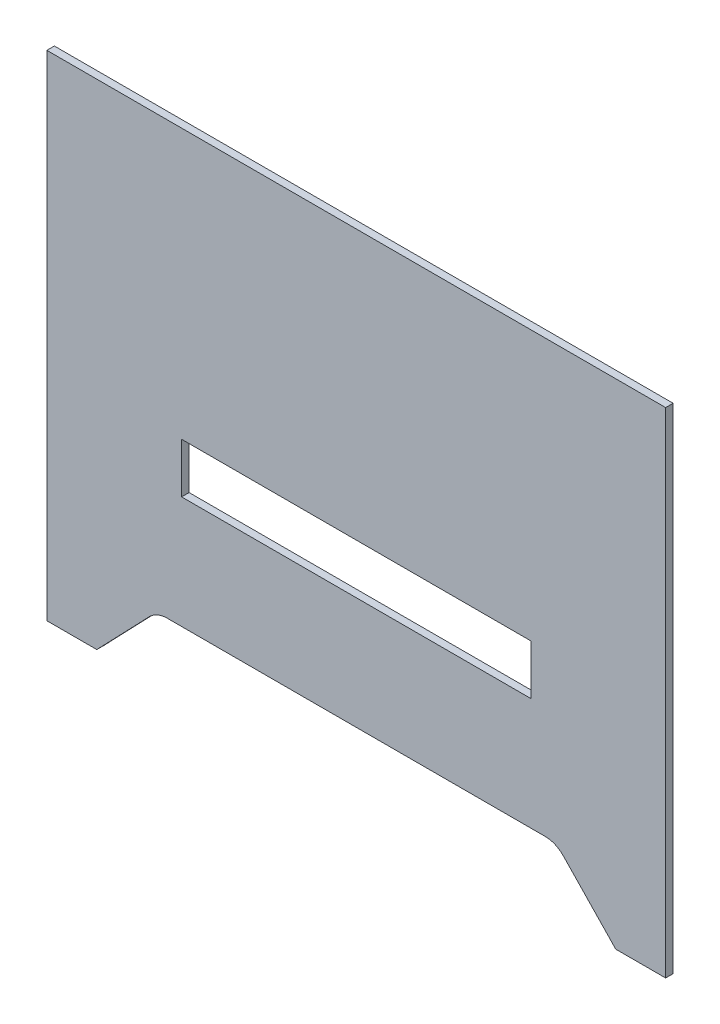
ISO-10303-21;
HEADER;
FILE_DESCRIPTION(('STEP AP214'),'2;1');
FILE_NAME('part.step','',(''),(''),'','','');
FILE_SCHEMA(('AUTOMOTIVE_DESIGN { 1 0 10303 214 1 1 1 1 }'));
ENDSEC;
DATA;
#1=APPLICATION_CONTEXT('core data for automotive mechanical design processes');
#2=APPLICATION_PROTOCOL_DEFINITION('international standard','automotive_design',2000,#1);
#3=PRODUCT_CONTEXT('',#1,'mechanical');
#4=PRODUCT('Part','Part','',(#3));
#5=PRODUCT_RELATED_PRODUCT_CATEGORY('part','',(#4));
#6=PRODUCT_DEFINITION_FORMATION('','',#4);
#7=PRODUCT_DEFINITION_CONTEXT('part definition',#1,'design');
#8=PRODUCT_DEFINITION('design','',#6,#7);
#9=PRODUCT_DEFINITION_SHAPE('','',#8);
#10=(LENGTH_UNIT() NAMED_UNIT(*) SI_UNIT(.MILLI.,.METRE.));
#11=(NAMED_UNIT(*) PLANE_ANGLE_UNIT() SI_UNIT($,.RADIAN.));
#12=(NAMED_UNIT(*) SI_UNIT($,.STERADIAN.) SOLID_ANGLE_UNIT());
#13=UNCERTAINTY_MEASURE_WITH_UNIT(LENGTH_MEASURE(1.E-05),#10,'distance_accuracy_value','');
#14=(GEOMETRIC_REPRESENTATION_CONTEXT(3) GLOBAL_UNCERTAINTY_ASSIGNED_CONTEXT((#13)) GLOBAL_UNIT_ASSIGNED_CONTEXT((#10,
#11,#12)) REPRESENTATION_CONTEXT('',''));
#15=CARTESIAN_POINT('',(0.,0.,0.));
#16=DIRECTION('',(0.,0.,1.));
#17=DIRECTION('',(1.,0.,0.));
#18=AXIS2_PLACEMENT_3D('',#15,#16,#17);
#19=CARTESIAN_POINT('',(-75.7378212390692,-84.,3.));
#20=DIRECTION('',(0.,0.,-1.));
#21=DIRECTION('',(-1.,0.,0.));
#22=AXIS2_PLACEMENT_3D('',#19,#20,#21);
#23=PLANE('',#22);
#24=DIRECTION('',(0.,1.,0.));
#25=VECTOR('',#24,1.);
#26=CARTESIAN_POINT('',(124.,-99.,3.));
#27=LINE('',#26,#25);
#28=CARTESIAN_POINT('',(124.,-99.,3.));
#29=VERTEX_POINT('',#28);
#30=CARTESIAN_POINT('',(124.,99.,3.));
#31=VERTEX_POINT('',#30);
#32=EDGE_CURVE('E176',#29,#31,#27,.T.);
#33=ORIENTED_EDGE('',*,*,#32,.T.);
#34=DIRECTION('',(-1.,0.,0.));
#35=VECTOR('',#34,1.);
#36=CARTESIAN_POINT('',(-124.,99.,3.));
#37=LINE('',#36,#35);
#38=CARTESIAN_POINT('',(-124.,99.,3.));
#39=VERTEX_POINT('',#38);
#40=EDGE_CURVE('E179',#31,#39,#37,.T.);
#41=ORIENTED_EDGE('',*,*,#40,.T.);
#42=DIRECTION('',(0.,-1.,0.));
#43=VECTOR('',#42,1.);
#44=CARTESIAN_POINT('',(-124.,-99.,3.));
#45=LINE('',#44,#43);
#46=CARTESIAN_POINT('',(-124.,-99.,3.));
#47=VERTEX_POINT('',#46);
#48=EDGE_CURVE('E182',#39,#47,#45,.T.);
#49=ORIENTED_EDGE('',*,*,#48,.T.);
#50=DIRECTION('',(1.,0.,0.));
#51=VECTOR('',#50,1.);
#52=CARTESIAN_POINT('',(-104.,-99.,3.));
#53=LINE('',#52,#51);
#54=CARTESIAN_POINT('',(-104.,-99.,3.));
#55=VERTEX_POINT('',#54);
#56=EDGE_CURVE('E184',#47,#55,#53,.T.);
#57=ORIENTED_EDGE('',*,*,#56,.T.);
#58=DIRECTION('',(0.692531828189714,0.721387321030951,0.));
#59=VECTOR('',#58,1.);
#60=CARTESIAN_POINT('',(-82.9516944493787,-77.0746817181029,3.));
#61=LINE('',#60,#59);
#62=CARTESIAN_POINT('',(-82.9516944493787,-77.0746817181029,3.));
#63=VERTEX_POINT('',#62);
#64=EDGE_CURVE('E186',#55,#63,#61,.T.);
#65=ORIENTED_EDGE('',*,*,#64,.T.);
#66=CARTESIAN_POINT('',(-75.7378212390692,-84.,3.));
#67=DIRECTION('',(0.,0.,-1.));
#68=DIRECTION('',(-1.,0.,0.));
#69=AXIS2_PLACEMENT_3D('',#66,#67,#68);
#70=CIRCLE('',#69,10.);
#71=CARTESIAN_POINT('',(-75.7378212390692,-74.,3.));
#72=VERTEX_POINT('',#71);
#73=EDGE_CURVE('E188',#63,#72,#70,.T.);
#74=ORIENTED_EDGE('',*,*,#73,.T.);
#75=DIRECTION('',(1.,0.,0.));
#76=VECTOR('',#75,1.);
#77=CARTESIAN_POINT('',(-75.7378212390692,-74.,3.));
#78=LINE('',#77,#76);
#79=CARTESIAN_POINT('',(75.7378212390692,-74.,3.));
#80=VERTEX_POINT('',#79);
#81=EDGE_CURVE('E190',#72,#80,#78,.T.);
#82=ORIENTED_EDGE('',*,*,#81,.T.);
#83=CARTESIAN_POINT('',(75.7378212390692,-84.,3.));
#84=DIRECTION('',(0.,0.,-1.));
#85=DIRECTION('',(1.,0.,0.));
#86=AXIS2_PLACEMENT_3D('',#83,#84,#85);
#87=CIRCLE('',#86,10.);
#88=CARTESIAN_POINT('',(82.9516944493787,-77.0746817181029,3.));
#89=VERTEX_POINT('',#88);
#90=EDGE_CURVE('E192',#80,#89,#87,.T.);
#91=ORIENTED_EDGE('',*,*,#90,.T.);
#92=DIRECTION('',(0.692531828189714,-0.721387321030951,0.));
#93=VECTOR('',#92,1.);
#94=CARTESIAN_POINT('',(82.9516944493787,-77.0746817181029,3.));
#95=LINE('',#94,#93);
#96=CARTESIAN_POINT('',(104.,-99.,3.));
#97=VERTEX_POINT('',#96);
#98=EDGE_CURVE('E194',#89,#97,#95,.T.);
#99=ORIENTED_EDGE('',*,*,#98,.T.);
#100=DIRECTION('',(1.,0.,0.));
#101=VECTOR('',#100,1.);
#102=CARTESIAN_POINT('',(104.,-99.,3.));
#103=LINE('',#102,#101);
#104=EDGE_CURVE('E196',#97,#29,#103,.T.);
#105=ORIENTED_EDGE('',*,*,#104,.T.);
#106=EDGE_LOOP('',(#33,#41,#49,#57,#65,#74,#82,#91,#99,#105));
#107=FACE_BOUND('',#106,.T.);
#108=DIRECTION('',(0.,1.,0.));
#109=VECTOR('',#108,1.);
#110=CARTESIAN_POINT('',(70.,-29.,3.));
#111=LINE('',#110,#109);
#112=CARTESIAN_POINT('',(70.,-29.,3.));
#113=VERTEX_POINT('',#112);
#114=CARTESIAN_POINT('',(70.,-9.00000000000001,3.));
#115=VERTEX_POINT('',#114);
#116=EDGE_CURVE('E140',#113,#115,#111,.T.);
#117=ORIENTED_EDGE('',*,*,#116,.F.);
#118=DIRECTION('',(1.,0.,0.));
#119=VECTOR('',#118,1.);
#120=CARTESIAN_POINT('',(-70.,-29.,3.));
#121=LINE('',#120,#119);
#122=CARTESIAN_POINT('',(-70.,-29.,3.));
#123=VERTEX_POINT('',#122);
#124=EDGE_CURVE('E162',#123,#113,#121,.T.);
#125=ORIENTED_EDGE('',*,*,#124,.F.);
#126=DIRECTION('',(0.,-1.,0.));
#127=VECTOR('',#126,1.);
#128=CARTESIAN_POINT('',(-70.,-29.,3.));
#129=LINE('',#128,#127);
#130=CARTESIAN_POINT('',(-70.,-9.00000000000001,3.));
#131=VERTEX_POINT('',#130);
#132=EDGE_CURVE('E160',#131,#123,#129,.T.);
#133=ORIENTED_EDGE('',*,*,#132,.F.);
#134=DIRECTION('',(-1.,0.,0.));
#135=VECTOR('',#134,1.);
#136=CARTESIAN_POINT('',(-70.,-9.00000000000001,3.));
#137=LINE('',#136,#135);
#138=EDGE_CURVE('E148',#115,#131,#137,.T.);
#139=ORIENTED_EDGE('',*,*,#138,.F.);
#140=EDGE_LOOP('',(#117,#125,#133,#139));
#141=FACE_BOUND('',#140,.T.);
#142=ADVANCED_FACE('F39',(#107,#141),#23,.F.);
#143=CARTESIAN_POINT('',(-75.7378212390692,-84.,0.));
#144=DIRECTION('',(0.,0.,-1.));
#145=DIRECTION('',(-1.,0.,0.));
#146=AXIS2_PLACEMENT_3D('',#143,#144,#145);
#147=PLANE('',#146);
#148=DIRECTION('',(0.,1.,0.));
#149=VECTOR('',#148,1.);
#150=CARTESIAN_POINT('',(124.,-99.,0.));
#151=LINE('',#150,#149);
#152=CARTESIAN_POINT('',(124.,-99.,0.));
#153=VERTEX_POINT('',#152);
#154=CARTESIAN_POINT('',(124.,99.,0.));
#155=VERTEX_POINT('',#154);
#156=EDGE_CURVE('E156',#153,#155,#151,.T.);
#157=ORIENTED_EDGE('',*,*,#156,.F.);
#158=DIRECTION('',(1.,0.,0.));
#159=VECTOR('',#158,1.);
#160=CARTESIAN_POINT('',(104.,-99.,0.));
#161=LINE('',#160,#159);
#162=CARTESIAN_POINT('',(104.,-99.,0.));
#163=VERTEX_POINT('',#162);
#164=EDGE_CURVE('E180',#163,#153,#161,.T.);
#165=ORIENTED_EDGE('',*,*,#164,.F.);
#166=DIRECTION('',(0.692531828189714,-0.721387321030951,0.));
#167=VECTOR('',#166,1.);
#168=CARTESIAN_POINT('',(82.9516944493787,-77.0746817181029,0.));
#169=LINE('',#168,#167);
#170=CARTESIAN_POINT('',(82.9516944493787,-77.0746817181029,0.));
#171=VERTEX_POINT('',#170);
#172=EDGE_CURVE('E215',#171,#163,#169,.T.);
#173=ORIENTED_EDGE('',*,*,#172,.F.);
#174=CARTESIAN_POINT('',(75.7378212390692,-84.,0.));
#175=DIRECTION('',(0.,0.,-1.));
#176=DIRECTION('',(1.,0.,0.));
#177=AXIS2_PLACEMENT_3D('',#174,#175,#176);
#178=CIRCLE('',#177,10.);
#179=CARTESIAN_POINT('',(75.7378212390692,-74.,0.));
#180=VERTEX_POINT('',#179);
#181=EDGE_CURVE('E213',#180,#171,#178,.T.);
#182=ORIENTED_EDGE('',*,*,#181,.F.);
#183=DIRECTION('',(1.,0.,0.));
#184=VECTOR('',#183,1.);
#185=CARTESIAN_POINT('',(-75.7378212390692,-74.,0.));
#186=LINE('',#185,#184);
#187=CARTESIAN_POINT('',(-75.7378212390692,-74.,0.));
#188=VERTEX_POINT('',#187);
#189=EDGE_CURVE('E211',#188,#180,#186,.T.);
#190=ORIENTED_EDGE('',*,*,#189,.F.);
#191=CARTESIAN_POINT('',(-75.7378212390692,-84.,0.));
#192=DIRECTION('',(0.,0.,-1.));
#193=DIRECTION('',(-1.,0.,0.));
#194=AXIS2_PLACEMENT_3D('',#191,#192,#193);
#195=CIRCLE('',#194,10.);
#196=CARTESIAN_POINT('',(-82.9516944493787,-77.0746817181029,0.));
#197=VERTEX_POINT('',#196);
#198=EDGE_CURVE('E209',#197,#188,#195,.T.);
#199=ORIENTED_EDGE('',*,*,#198,.F.);
#200=DIRECTION('',(0.692531828189714,0.721387321030951,0.));
#201=VECTOR('',#200,1.);
#202=CARTESIAN_POINT('',(-82.9516944493787,-77.0746817181029,0.));
#203=LINE('',#202,#201);
#204=CARTESIAN_POINT('',(-104.,-99.,0.));
#205=VERTEX_POINT('',#204);
#206=EDGE_CURVE('E207',#205,#197,#203,.T.);
#207=ORIENTED_EDGE('',*,*,#206,.F.);
#208=DIRECTION('',(1.,0.,0.));
#209=VECTOR('',#208,1.);
#210=CARTESIAN_POINT('',(-104.,-99.,0.));
#211=LINE('',#210,#209);
#212=CARTESIAN_POINT('',(-124.,-99.,0.));
#213=VERTEX_POINT('',#212);
#214=EDGE_CURVE('E205',#213,#205,#211,.T.);
#215=ORIENTED_EDGE('',*,*,#214,.F.);
#216=DIRECTION('',(0.,-1.,0.));
#217=VECTOR('',#216,1.);
#218=CARTESIAN_POINT('',(-124.,-99.,0.));
#219=LINE('',#218,#217);
#220=CARTESIAN_POINT('',(-124.,99.,0.));
#221=VERTEX_POINT('',#220);
#222=EDGE_CURVE('E203',#221,#213,#219,.T.);
#223=ORIENTED_EDGE('',*,*,#222,.F.);
#224=DIRECTION('',(-1.,0.,0.));
#225=VECTOR('',#224,1.);
#226=CARTESIAN_POINT('',(-124.,99.,0.));
#227=LINE('',#226,#225);
#228=EDGE_CURVE('E201',#155,#221,#227,.T.);
#229=ORIENTED_EDGE('',*,*,#228,.F.);
#230=EDGE_LOOP('',(#157,#165,#173,#182,#190,#199,#207,#215,#223,#229));
#231=FACE_BOUND('',#230,.T.);
#232=DIRECTION('',(1.,0.,0.));
#233=VECTOR('',#232,1.);
#234=CARTESIAN_POINT('',(-70.,-29.,0.));
#235=LINE('',#234,#233);
#236=CARTESIAN_POINT('',(-70.,-29.,0.));
#237=VERTEX_POINT('',#236);
#238=CARTESIAN_POINT('',(70.,-29.,0.));
#239=VERTEX_POINT('',#238);
#240=EDGE_CURVE('E149',#237,#239,#235,.T.);
#241=ORIENTED_EDGE('',*,*,#240,.T.);
#242=DIRECTION('',(0.,1.,0.));
#243=VECTOR('',#242,1.);
#244=CARTESIAN_POINT('',(70.,-29.,0.));
#245=LINE('',#244,#243);
#246=CARTESIAN_POINT('',(70.,-9.00000000000001,0.));
#247=VERTEX_POINT('',#246);
#248=EDGE_CURVE('E62',#239,#247,#245,.T.);
#249=ORIENTED_EDGE('',*,*,#248,.T.);
#250=DIRECTION('',(-1.,0.,0.));
#251=VECTOR('',#250,1.);
#252=CARTESIAN_POINT('',(-70.,-9.00000000000001,0.));
#253=LINE('',#252,#251);
#254=CARTESIAN_POINT('',(-70.,-9.00000000000001,0.));
#255=VERTEX_POINT('',#254);
#256=EDGE_CURVE('E155',#247,#255,#253,.T.);
#257=ORIENTED_EDGE('',*,*,#256,.T.);
#258=DIRECTION('',(0.,-1.,0.));
#259=VECTOR('',#258,1.);
#260=CARTESIAN_POINT('',(-70.,-29.,0.));
#261=LINE('',#260,#259);
#262=EDGE_CURVE('E168',#255,#237,#261,.T.);
#263=ORIENTED_EDGE('',*,*,#262,.T.);
#264=EDGE_LOOP('',(#241,#249,#257,#263));
#265=FACE_BOUND('',#264,.T.);
#266=ADVANCED_FACE('F251',(#231,#265),#147,.T.);
#267=CARTESIAN_POINT('',(124.,-99.,3.));
#268=DIRECTION('',(-1.,0.,0.));
#269=DIRECTION('',(0.,0.,1.));
#270=AXIS2_PLACEMENT_3D('',#267,#268,#269);
#271=PLANE('',#270);
#272=ORIENTED_EDGE('',*,*,#156,.T.);
#273=DIRECTION('',(0.,0.,-1.));
#274=VECTOR('',#273,1.);
#275=CARTESIAN_POINT('',(124.,99.,3.));
#276=LINE('',#275,#274);
#277=EDGE_CURVE('E11',#31,#155,#276,.T.);
#278=ORIENTED_EDGE('',*,*,#277,.F.);
#279=ORIENTED_EDGE('',*,*,#32,.F.);
#280=DIRECTION('',(0.,0.,-1.));
#281=VECTOR('',#280,1.);
#282=CARTESIAN_POINT('',(124.,-99.,3.));
#283=LINE('',#282,#281);
#284=EDGE_CURVE('E198',#29,#153,#283,.T.);
#285=ORIENTED_EDGE('',*,*,#284,.T.);
#286=EDGE_LOOP('',(#272,#278,#279,#285));
#287=FACE_BOUND('',#286,.T.);
#288=ADVANCED_FACE('F41',(#287),#271,.F.);
#289=CARTESIAN_POINT('',(-124.,99.,3.));
#290=DIRECTION('',(0.,-1.,0.));
#291=DIRECTION('',(0.,0.,-1.));
#292=AXIS2_PLACEMENT_3D('',#289,#290,#291);
#293=PLANE('',#292);
#294=ORIENTED_EDGE('',*,*,#228,.T.);
#295=DIRECTION('',(0.,0.,-1.));
#296=VECTOR('',#295,1.);
#297=CARTESIAN_POINT('',(-124.,99.,3.));
#298=LINE('',#297,#296);
#299=EDGE_CURVE('E47',#39,#221,#298,.T.);
#300=ORIENTED_EDGE('',*,*,#299,.F.);
#301=ORIENTED_EDGE('',*,*,#40,.F.);
#302=ORIENTED_EDGE('',*,*,#277,.T.);
#303=EDGE_LOOP('',(#294,#300,#301,#302));
#304=FACE_BOUND('',#303,.T.);
#305=ADVANCED_FACE('F268',(#304),#293,.F.);
#306=CARTESIAN_POINT('',(-124.,-99.,3.));
#307=DIRECTION('',(1.,0.,0.));
#308=DIRECTION('',(0.,0.,-1.));
#309=AXIS2_PLACEMENT_3D('',#306,#307,#308);
#310=PLANE('',#309);
#311=ORIENTED_EDGE('',*,*,#222,.T.);
#312=DIRECTION('',(0.,0.,-1.));
#313=VECTOR('',#312,1.);
#314=CARTESIAN_POINT('',(-124.,-99.,3.));
#315=LINE('',#314,#313);
#316=EDGE_CURVE('E238',#47,#213,#315,.T.);
#317=ORIENTED_EDGE('',*,*,#316,.F.);
#318=ORIENTED_EDGE('',*,*,#48,.F.);
#319=ORIENTED_EDGE('',*,*,#299,.T.);
#320=EDGE_LOOP('',(#311,#317,#318,#319));
#321=FACE_BOUND('',#320,.T.);
#322=ADVANCED_FACE('F245',(#321),#310,.F.);
#323=CARTESIAN_POINT('',(-104.,-99.,3.));
#324=DIRECTION('',(0.,1.,0.));
#325=DIRECTION('',(0.,0.,1.));
#326=AXIS2_PLACEMENT_3D('',#323,#324,#325);
#327=PLANE('',#326);
#328=ORIENTED_EDGE('',*,*,#214,.T.);
#329=DIRECTION('',(0.,0.,-1.));
#330=VECTOR('',#329,1.);
#331=CARTESIAN_POINT('',(-104.,-99.,3.));
#332=LINE('',#331,#330);
#333=EDGE_CURVE('E235',#55,#205,#332,.T.);
#334=ORIENTED_EDGE('',*,*,#333,.F.);
#335=ORIENTED_EDGE('',*,*,#56,.F.);
#336=ORIENTED_EDGE('',*,*,#316,.T.);
#337=EDGE_LOOP('',(#328,#334,#335,#336));
#338=FACE_BOUND('',#337,.T.);
#339=ADVANCED_FACE('F257',(#338),#327,.F.);
#340=CARTESIAN_POINT('',(-82.9516944493787,-77.0746817181029,3.));
#341=DIRECTION('',(-0.721387321030951,0.692531828189714,0.));
#342=DIRECTION('',(-0.692531828189714,-0.721387321030951,0.));
#343=AXIS2_PLACEMENT_3D('',#340,#341,#342);
#344=PLANE('',#343);
#345=ORIENTED_EDGE('',*,*,#206,.T.);
#346=DIRECTION('',(0.,0.,-1.));
#347=VECTOR('',#346,1.);
#348=CARTESIAN_POINT('',(-82.9516944493787,-77.0746817181029,3.));
#349=LINE('',#348,#347);
#350=EDGE_CURVE('E232',#63,#197,#349,.T.);
#351=ORIENTED_EDGE('',*,*,#350,.F.);
#352=ORIENTED_EDGE('',*,*,#64,.F.);
#353=ORIENTED_EDGE('',*,*,#333,.T.);
#354=EDGE_LOOP('',(#345,#351,#352,#353));
#355=FACE_BOUND('',#354,.T.);
#356=ADVANCED_FACE('F261',(#355),#344,.F.);
#357=CARTESIAN_POINT('',(-75.7378212390692,-84.,3.));
#358=DIRECTION('',(0.,0.,-1.));
#359=DIRECTION('',(-1.,0.,0.));
#360=AXIS2_PLACEMENT_3D('',#357,#358,#359);
#361=CYLINDRICAL_SURFACE('',#360,10.);
#362=ORIENTED_EDGE('',*,*,#198,.T.);
#363=DIRECTION('',(0.,0.,-1.));
#364=VECTOR('',#363,1.);
#365=CARTESIAN_POINT('',(-75.7378212390692,-74.,3.));
#366=LINE('',#365,#364);
#367=EDGE_CURVE('E229',#72,#188,#366,.T.);
#368=ORIENTED_EDGE('',*,*,#367,.F.);
#369=ORIENTED_EDGE('',*,*,#73,.F.);
#370=ORIENTED_EDGE('',*,*,#350,.T.);
#371=EDGE_LOOP('',(#362,#368,#369,#370));
#372=FACE_BOUND('',#371,.T.);
#373=ADVANCED_FACE('F291',(#372),#361,.F.);
#374=CARTESIAN_POINT('',(-75.7378212390692,-74.,3.));
#375=DIRECTION('',(0.,1.,0.));
#376=DIRECTION('',(0.,0.,1.));
#377=AXIS2_PLACEMENT_3D('',#374,#375,#376);
#378=PLANE('',#377);
#379=ORIENTED_EDGE('',*,*,#189,.T.);
#380=DIRECTION('',(0.,0.,-1.));
#381=VECTOR('',#380,1.);
#382=CARTESIAN_POINT('',(75.7378212390692,-74.,3.));
#383=LINE('',#382,#381);
#384=EDGE_CURVE('E226',#80,#180,#383,.T.);
#385=ORIENTED_EDGE('',*,*,#384,.F.);
#386=ORIENTED_EDGE('',*,*,#81,.F.);
#387=ORIENTED_EDGE('',*,*,#367,.T.);
#388=EDGE_LOOP('',(#379,#385,#386,#387));
#389=FACE_BOUND('',#388,.T.);
#390=ADVANCED_FACE('F288',(#389),#378,.F.);
#391=CARTESIAN_POINT('',(75.7378212390692,-84.,3.));
#392=DIRECTION('',(0.,0.,-1.));
#393=DIRECTION('',(-1.,0.,0.));
#394=AXIS2_PLACEMENT_3D('',#391,#392,#393);
#395=CYLINDRICAL_SURFACE('',#394,10.);
#396=ORIENTED_EDGE('',*,*,#181,.T.);
#397=DIRECTION('',(0.,0.,-1.));
#398=VECTOR('',#397,1.);
#399=CARTESIAN_POINT('',(82.9516944493787,-77.0746817181029,3.));
#400=LINE('',#399,#398);
#401=EDGE_CURVE('E223',#89,#171,#400,.T.);
#402=ORIENTED_EDGE('',*,*,#401,.F.);
#403=ORIENTED_EDGE('',*,*,#90,.F.);
#404=ORIENTED_EDGE('',*,*,#384,.T.);
#405=EDGE_LOOP('',(#396,#402,#403,#404));
#406=FACE_BOUND('',#405,.T.);
#407=ADVANCED_FACE('F284',(#406),#395,.F.);
#408=CARTESIAN_POINT('',(82.9516944493787,-77.0746817181029,3.));
#409=DIRECTION('',(0.721387321030951,0.692531828189714,0.));
#410=DIRECTION('',(-0.692531828189714,0.721387321030951,0.));
#411=AXIS2_PLACEMENT_3D('',#408,#409,#410);
#412=PLANE('',#411);
#413=ORIENTED_EDGE('',*,*,#172,.T.);
#414=DIRECTION('',(0.,0.,-1.));
#415=VECTOR('',#414,1.);
#416=CARTESIAN_POINT('',(104.,-99.,3.));
#417=LINE('',#416,#415);
#418=EDGE_CURVE('E220',#97,#163,#417,.T.);
#419=ORIENTED_EDGE('',*,*,#418,.F.);
#420=ORIENTED_EDGE('',*,*,#98,.F.);
#421=ORIENTED_EDGE('',*,*,#401,.T.);
#422=EDGE_LOOP('',(#413,#419,#420,#421));
#423=FACE_BOUND('',#422,.T.);
#424=ADVANCED_FACE('F280',(#423),#412,.F.);
#425=CARTESIAN_POINT('',(104.,-99.,3.));
#426=DIRECTION('',(0.,1.,0.));
#427=DIRECTION('',(0.,0.,1.));
#428=AXIS2_PLACEMENT_3D('',#425,#426,#427);
#429=PLANE('',#428);
#430=ORIENTED_EDGE('',*,*,#164,.T.);
#431=ORIENTED_EDGE('',*,*,#284,.F.);
#432=ORIENTED_EDGE('',*,*,#104,.F.);
#433=ORIENTED_EDGE('',*,*,#418,.T.);
#434=EDGE_LOOP('',(#430,#431,#432,#433));
#435=FACE_BOUND('',#434,.T.);
#436=ADVANCED_FACE('F275',(#435),#429,.F.);
#437=CARTESIAN_POINT('',(70.,-29.,3.));
#438=DIRECTION('',(-1.,0.,0.));
#439=DIRECTION('',(0.,0.,1.));
#440=AXIS2_PLACEMENT_3D('',#437,#438,#439);
#441=PLANE('',#440);
#442=ORIENTED_EDGE('',*,*,#248,.F.);
#443=DIRECTION('',(0.,0.,-1.));
#444=VECTOR('',#443,1.);
#445=CARTESIAN_POINT('',(70.,-29.,3.));
#446=LINE('',#445,#444);
#447=EDGE_CURVE('E144',#113,#239,#446,.T.);
#448=ORIENTED_EDGE('',*,*,#447,.F.);
#449=ORIENTED_EDGE('',*,*,#116,.T.);
#450=DIRECTION('',(0.,0.,-1.));
#451=VECTOR('',#450,1.);
#452=CARTESIAN_POINT('',(70.,-9.00000000000001,3.));
#453=LINE('',#452,#451);
#454=EDGE_CURVE('E143',#115,#247,#453,.T.);
#455=ORIENTED_EDGE('',*,*,#454,.T.);
#456=EDGE_LOOP('',(#442,#448,#449,#455));
#457=FACE_BOUND('',#456,.T.);
#458=ADVANCED_FACE('F142',(#457),#441,.T.);
#459=CARTESIAN_POINT('',(-70.,-9.00000000000001,3.));
#460=DIRECTION('',(0.,-1.,0.));
#461=DIRECTION('',(0.,0.,-1.));
#462=AXIS2_PLACEMENT_3D('',#459,#460,#461);
#463=PLANE('',#462);
#464=ORIENTED_EDGE('',*,*,#256,.F.);
#465=ORIENTED_EDGE('',*,*,#454,.F.);
#466=ORIENTED_EDGE('',*,*,#138,.T.);
#467=DIRECTION('',(0.,0.,-1.));
#468=VECTOR('',#467,1.);
#469=CARTESIAN_POINT('',(-70.,-9.00000000000001,3.));
#470=LINE('',#469,#468);
#471=EDGE_CURVE('E157',#131,#255,#470,.T.);
#472=ORIENTED_EDGE('',*,*,#471,.T.);
#473=EDGE_LOOP('',(#464,#465,#466,#472));
#474=FACE_BOUND('',#473,.T.);
#475=ADVANCED_FACE('F152',(#474),#463,.T.);
#476=CARTESIAN_POINT('',(-70.,-29.,3.));
#477=DIRECTION('',(1.,0.,0.));
#478=DIRECTION('',(0.,0.,-1.));
#479=AXIS2_PLACEMENT_3D('',#476,#477,#478);
#480=PLANE('',#479);
#481=ORIENTED_EDGE('',*,*,#262,.F.);
#482=ORIENTED_EDGE('',*,*,#471,.F.);
#483=ORIENTED_EDGE('',*,*,#132,.T.);
#484=DIRECTION('',(0.,0.,-1.));
#485=VECTOR('',#484,1.);
#486=CARTESIAN_POINT('',(-70.,-29.,3.));
#487=LINE('',#486,#485);
#488=EDGE_CURVE('E54',#123,#237,#487,.T.);
#489=ORIENTED_EDGE('',*,*,#488,.T.);
#490=EDGE_LOOP('',(#481,#482,#483,#489));
#491=FACE_BOUND('',#490,.T.);
#492=ADVANCED_FACE('F337',(#491),#480,.T.);
#493=CARTESIAN_POINT('',(-70.,-29.,3.));
#494=DIRECTION('',(0.,1.,0.));
#495=DIRECTION('',(0.,0.,1.));
#496=AXIS2_PLACEMENT_3D('',#493,#494,#495);
#497=PLANE('',#496);
#498=ORIENTED_EDGE('',*,*,#240,.F.);
#499=ORIENTED_EDGE('',*,*,#488,.F.);
#500=ORIENTED_EDGE('',*,*,#124,.T.);
#501=ORIENTED_EDGE('',*,*,#447,.T.);
#502=EDGE_LOOP('',(#498,#499,#500,#501));
#503=FACE_BOUND('',#502,.T.);
#504=ADVANCED_FACE('F343',(#503),#497,.T.);
#505=CLOSED_SHELL('',(#142,#266,#288,#305,#322,#339,#356,#373,#390,#407,#424,#436,#458,#475,
#492,#504));
#506=MANIFOLD_SOLID_BREP('B2',#505);
#507=ADVANCED_BREP_SHAPE_REPRESENTATION('',(#18,#506),#14);
#508=SHAPE_DEFINITION_REPRESENTATION(#9,#507);
ENDSEC;
END-ISO-10303-21;
